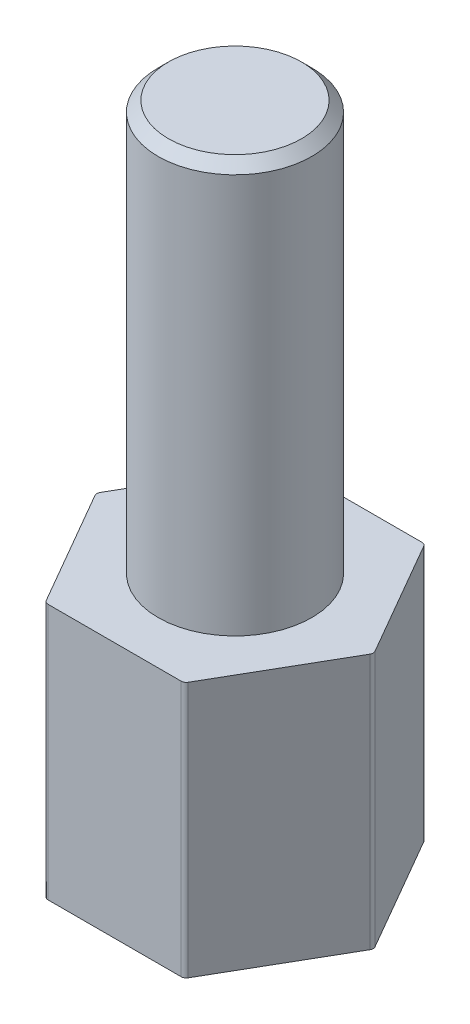
ISO-10303-21;
HEADER;
FILE_DESCRIPTION(('STEP AP214'),'2;1');
FILE_NAME('part.step','',(''),(''),'','','');
FILE_SCHEMA(('AUTOMOTIVE_DESIGN { 1 0 10303 214 1 1 1 1 }'));
ENDSEC;
DATA;
#1=APPLICATION_CONTEXT('core data for automotive mechanical design processes');
#2=APPLICATION_PROTOCOL_DEFINITION('international standard','automotive_design',2000,#1);
#3=PRODUCT_CONTEXT('',#1,'mechanical');
#4=PRODUCT('Part','Part','',(#3));
#5=PRODUCT_RELATED_PRODUCT_CATEGORY('part','',(#4));
#6=PRODUCT_DEFINITION_FORMATION('','',#4);
#7=PRODUCT_DEFINITION_CONTEXT('part definition',#1,'design');
#8=PRODUCT_DEFINITION('design','',#6,#7);
#9=PRODUCT_DEFINITION_SHAPE('','',#8);
#10=(LENGTH_UNIT() NAMED_UNIT(*) SI_UNIT(.MILLI.,.METRE.));
#11=(NAMED_UNIT(*) PLANE_ANGLE_UNIT() SI_UNIT($,.RADIAN.));
#12=(NAMED_UNIT(*) SI_UNIT($,.STERADIAN.) SOLID_ANGLE_UNIT());
#13=UNCERTAINTY_MEASURE_WITH_UNIT(LENGTH_MEASURE(1.E-05),#10,'distance_accuracy_value','');
#14=(GEOMETRIC_REPRESENTATION_CONTEXT(3) GLOBAL_UNCERTAINTY_ASSIGNED_CONTEXT((#13)) GLOBAL_UNIT_ASSIGNED_CONTEXT((#10,
#11,#12)) REPRESENTATION_CONTEXT('',''));
#15=CARTESIAN_POINT('',(0.,0.,0.));
#16=DIRECTION('',(0.,0.,1.));
#17=DIRECTION('',(1.,0.,0.));
#18=AXIS2_PLACEMENT_3D('',#15,#16,#17);
#19=CARTESIAN_POINT('',(1.35677313259565,5.,2.34999999999999));
#20=DIRECTION('',(-0.866025403784441,0.,-0.499999999999995));
#21=DIRECTION('',(-0.499999999999995,0.,0.866025403784441));
#22=AXIS2_PLACEMENT_3D('',#19,#20,#21);
#23=PLANE('',#22);
#24=DIRECTION('',(0.499999999999995,0.,-0.866025403784441));
#25=VECTOR('',#24,1.);
#26=CARTESIAN_POINT('',(1.35677313259565,5.,2.34999999999999));
#27=LINE('',#26,#25);
#28=CARTESIAN_POINT('',(1.38564064605513,5.,2.29999999999999));
#29=VERTEX_POINT('',#28);
#30=CARTESIAN_POINT('',(2.68467875173176,5.,0.0500000000000001));
#31=VERTEX_POINT('',#30);
#32=EDGE_CURVE('E148',#29,#31,#27,.T.);
#33=ORIENTED_EDGE('',*,*,#32,.F.);
#34=DIRECTION('',(0.,-1.,0.));
#35=VECTOR('',#34,1.);
#36=CARTESIAN_POINT('',(1.38564064605513,5.,2.29999999999999));
#37=LINE('',#36,#35);
#38=CARTESIAN_POINT('',(1.38564064605513,0.,2.29999999999999));
#39=VERTEX_POINT('',#38);
#40=EDGE_CURVE('E133',#29,#39,#37,.T.);
#41=ORIENTED_EDGE('',*,*,#40,.T.);
#42=DIRECTION('',(0.499999999999995,0.,-0.866025403784441));
#43=VECTOR('',#42,1.);
#44=CARTESIAN_POINT('',(1.35677313259565,0.,2.34999999999999));
#45=LINE('',#44,#43);
#46=CARTESIAN_POINT('',(2.68467875173176,0.,0.0500000000000001));
#47=VERTEX_POINT('',#46);
#48=EDGE_CURVE('E145',#39,#47,#45,.T.);
#49=ORIENTED_EDGE('',*,*,#48,.T.);
#50=DIRECTION('',(0.,-1.,0.));
#51=VECTOR('',#50,1.);
#52=CARTESIAN_POINT('',(2.68467875173176,5.,0.0499999999999997));
#53=LINE('',#52,#51);
#54=EDGE_CURVE('E150',#47,#31,#53,.F.);
#55=ORIENTED_EDGE('',*,*,#54,.T.);
#56=EDGE_LOOP('',(#33,#41,#49,#55));
#57=FACE_BOUND('',#56,.T.);
#58=ADVANCED_FACE('F39',(#57),#23,.F.);
#59=CARTESIAN_POINT('',(2.71354626519124,5.,0.));
#60=DIRECTION('',(-0.866025403784438,0.,0.500000000000001));
#61=DIRECTION('',(0.500000000000001,0.,0.866025403784438));
#62=AXIS2_PLACEMENT_3D('',#59,#60,#61);
#63=PLANE('',#62);
#64=DIRECTION('',(-0.500000000000001,0.,-0.866025403784438));
#65=VECTOR('',#64,1.);
#66=CARTESIAN_POINT('',(2.71354626519124,0.,0.));
#67=LINE('',#66,#65);
#68=CARTESIAN_POINT('',(2.68467875173176,0.,-0.0499999999999996));
#69=VERTEX_POINT('',#68);
#70=CARTESIAN_POINT('',(1.3856406460551,0.,-2.30000000000001));
#71=VERTEX_POINT('',#70);
#72=EDGE_CURVE('E154',#69,#71,#67,.T.);
#73=ORIENTED_EDGE('',*,*,#72,.T.);
#74=DIRECTION('',(0.,-1.,0.));
#75=VECTOR('',#74,1.);
#76=CARTESIAN_POINT('',(1.3856406460551,5.,-2.30000000000001));
#77=LINE('',#76,#75);
#78=CARTESIAN_POINT('',(1.3856406460551,5.,-2.30000000000001));
#79=VERTEX_POINT('',#78);
#80=EDGE_CURVE('E11',#71,#79,#77,.F.);
#81=ORIENTED_EDGE('',*,*,#80,.T.);
#82=DIRECTION('',(-0.500000000000001,0.,-0.866025403784438));
#83=VECTOR('',#82,1.);
#84=CARTESIAN_POINT('',(2.71354626519124,5.,0.));
#85=LINE('',#84,#83);
#86=CARTESIAN_POINT('',(2.68467875173176,5.,-0.0499999999999996));
#87=VERTEX_POINT('',#86);
#88=EDGE_CURVE('E231',#87,#79,#85,.T.);
#89=ORIENTED_EDGE('',*,*,#88,.F.);
#90=DIRECTION('',(0.,-1.,0.));
#91=VECTOR('',#90,1.);
#92=CARTESIAN_POINT('',(2.68467875173176,5.,-0.0499999999999996));
#93=LINE('',#92,#91);
#94=EDGE_CURVE('E47',#87,#69,#93,.T.);
#95=ORIENTED_EDGE('',*,*,#94,.T.);
#96=EDGE_LOOP('',(#73,#81,#89,#95));
#97=FACE_BOUND('',#96,.T.);
#98=ADVANCED_FACE('F228',(#97),#63,.F.);
#99=CARTESIAN_POINT('',(1.35677313259562,5.,-2.35000000000001));
#100=DIRECTION('',(0.,0.,1.));
#101=DIRECTION('',(1.,0.,0.));
#102=AXIS2_PLACEMENT_3D('',#99,#100,#101);
#103=PLANE('',#102);
#104=DIRECTION('',(-1.,0.,0.));
#105=VECTOR('',#104,1.);
#106=CARTESIAN_POINT('',(1.35677313259562,0.,-2.35000000000001));
#107=LINE('',#106,#105);
#108=CARTESIAN_POINT('',(1.29903810567665,0.,-2.35000000000001));
#109=VERTEX_POINT('',#108);
#110=CARTESIAN_POINT('',(-1.29903810567667,0.,-2.35));
#111=VERTEX_POINT('',#110);
#112=EDGE_CURVE('E158',#109,#111,#107,.T.);
#113=ORIENTED_EDGE('',*,*,#112,.T.);
#114=DIRECTION('',(0.,-1.,0.));
#115=VECTOR('',#114,1.);
#116=CARTESIAN_POINT('',(-1.29903810567667,5.,-2.35));
#117=LINE('',#116,#115);
#118=CARTESIAN_POINT('',(-1.29903810567667,5.,-2.35));
#119=VERTEX_POINT('',#118);
#120=EDGE_CURVE('E223',#111,#119,#117,.F.);
#121=ORIENTED_EDGE('',*,*,#120,.T.);
#122=DIRECTION('',(-1.,0.,0.));
#123=VECTOR('',#122,1.);
#124=CARTESIAN_POINT('',(1.35677313259562,5.,-2.35000000000001));
#125=LINE('',#124,#123);
#126=CARTESIAN_POINT('',(1.29903810567665,5.,-2.35000000000001));
#127=VERTEX_POINT('',#126);
#128=EDGE_CURVE('E244',#127,#119,#125,.T.);
#129=ORIENTED_EDGE('',*,*,#128,.F.);
#130=DIRECTION('',(0.,-1.,0.));
#131=VECTOR('',#130,1.);
#132=CARTESIAN_POINT('',(1.29903810567665,5.,-2.35000000000001));
#133=LINE('',#132,#131);
#134=EDGE_CURVE('E220',#127,#109,#133,.T.);
#135=ORIENTED_EDGE('',*,*,#134,.T.);
#136=EDGE_LOOP('',(#113,#121,#129,#135));
#137=FACE_BOUND('',#136,.T.);
#138=ADVANCED_FACE('F241',(#137),#103,.F.);
#139=CARTESIAN_POINT('',(-1.35677313259563,5.,-2.35));
#140=DIRECTION('',(0.866025403784442,0.,0.499999999999995));
#141=DIRECTION('',(0.499999999999995,0.,-0.866025403784442));
#142=AXIS2_PLACEMENT_3D('',#139,#140,#141);
#143=PLANE('',#142);
#144=DIRECTION('',(-0.499999999999995,0.,0.866025403784441));
#145=VECTOR('',#144,1.);
#146=CARTESIAN_POINT('',(-1.35677313259563,0.,-2.35));
#147=LINE('',#146,#145);
#148=CARTESIAN_POINT('',(-1.38564064605511,0.,-2.3));
#149=VERTEX_POINT('',#148);
#150=CARTESIAN_POINT('',(-2.68467875173176,0.,-0.0499999999999824));
#151=VERTEX_POINT('',#150);
#152=EDGE_CURVE('E169',#149,#151,#147,.T.);
#153=ORIENTED_EDGE('',*,*,#152,.T.);
#154=DIRECTION('',(0.,-1.,0.));
#155=VECTOR('',#154,1.);
#156=CARTESIAN_POINT('',(-2.68467875173176,5.,-0.0499999999999815));
#157=LINE('',#156,#155);
#158=CARTESIAN_POINT('',(-2.68467875173176,5.,-0.0499999999999824));
#159=VERTEX_POINT('',#158);
#160=EDGE_CURVE('E218',#151,#159,#157,.F.);
#161=ORIENTED_EDGE('',*,*,#160,.T.);
#162=DIRECTION('',(-0.499999999999995,0.,0.866025403784441));
#163=VECTOR('',#162,1.);
#164=CARTESIAN_POINT('',(-1.35677313259563,5.,-2.35));
#165=LINE('',#164,#163);
#166=CARTESIAN_POINT('',(-1.38564064605511,5.,-2.3));
#167=VERTEX_POINT('',#166);
#168=EDGE_CURVE('E246',#167,#159,#165,.T.);
#169=ORIENTED_EDGE('',*,*,#168,.F.);
#170=DIRECTION('',(0.,-1.,0.));
#171=VECTOR('',#170,1.);
#172=CARTESIAN_POINT('',(-1.38564064605511,5.,-2.3));
#173=LINE('',#172,#171);
#174=EDGE_CURVE('E215',#167,#149,#173,.T.);
#175=ORIENTED_EDGE('',*,*,#174,.T.);
#176=EDGE_LOOP('',(#153,#161,#169,#175));
#177=FACE_BOUND('',#176,.T.);
#178=ADVANCED_FACE('F269',(#177),#143,.F.);
#179=CARTESIAN_POINT('',(-2.71354626519124,5.,0.));
#180=DIRECTION('',(0.866025403784434,0.,-0.500000000000007));
#181=DIRECTION('',(-0.500000000000007,0.,-0.866025403784435));
#182=AXIS2_PLACEMENT_3D('',#179,#180,#181);
#183=PLANE('',#182);
#184=DIRECTION('',(0.500000000000007,0.,0.866025403784435));
#185=VECTOR('',#184,1.);
#186=CARTESIAN_POINT('',(-2.71354626519124,0.,0.));
#187=LINE('',#186,#185);
#188=CARTESIAN_POINT('',(-2.68467875173176,0.,0.0500000000000188));
#189=VERTEX_POINT('',#188);
#190=CARTESIAN_POINT('',(-1.38564064605508,0.,2.30000000000001));
#191=VERTEX_POINT('',#190);
#192=EDGE_CURVE('E172',#189,#191,#187,.T.);
#193=ORIENTED_EDGE('',*,*,#192,.T.);
#194=DIRECTION('',(0.,-1.,0.));
#195=VECTOR('',#194,1.);
#196=CARTESIAN_POINT('',(-1.38564064605508,5.,2.30000000000001));
#197=LINE('',#196,#195);
#198=CARTESIAN_POINT('',(-1.38564064605508,5.,2.30000000000001));
#199=VERTEX_POINT('',#198);
#200=EDGE_CURVE('E54',#191,#199,#197,.F.);
#201=ORIENTED_EDGE('',*,*,#200,.T.);
#202=DIRECTION('',(0.500000000000007,0.,0.866025403784435));
#203=VECTOR('',#202,1.);
#204=CARTESIAN_POINT('',(-2.71354626519124,5.,0.));
#205=LINE('',#204,#203);
#206=CARTESIAN_POINT('',(-2.68467875173176,5.,0.0500000000000188));
#207=VERTEX_POINT('',#206);
#208=EDGE_CURVE('E248',#207,#199,#205,.T.);
#209=ORIENTED_EDGE('',*,*,#208,.F.);
#210=DIRECTION('',(0.,-1.,0.));
#211=VECTOR('',#210,1.);
#212=CARTESIAN_POINT('',(-2.68467875173176,5.,0.0500000000000188));
#213=LINE('',#212,#211);
#214=EDGE_CURVE('E211',#207,#189,#213,.T.);
#215=ORIENTED_EDGE('',*,*,#214,.T.);
#216=EDGE_LOOP('',(#193,#201,#209,#215));
#217=FACE_BOUND('',#216,.T.);
#218=ADVANCED_FACE('F262',(#217),#183,.F.);
#219=CARTESIAN_POINT('',(-1.3567731325956,5.,2.35000000000001));
#220=DIRECTION('',(0.,0.,-1.));
#221=DIRECTION('',(-1.,0.,0.));
#222=AXIS2_PLACEMENT_3D('',#219,#220,#221);
#223=PLANE('',#222);
#224=DIRECTION('',(1.,0.,0.));
#225=VECTOR('',#224,1.);
#226=CARTESIAN_POINT('',(-1.3567731325956,0.,2.35000000000001));
#227=LINE('',#226,#225);
#228=CARTESIAN_POINT('',(-1.29903810567664,0.,2.35000000000001));
#229=VERTEX_POINT('',#228);
#230=CARTESIAN_POINT('',(1.29903810567669,0.,2.34999999999999));
#231=VERTEX_POINT('',#230);
#232=EDGE_CURVE('E174',#229,#231,#227,.T.);
#233=ORIENTED_EDGE('',*,*,#232,.T.);
#234=DIRECTION('',(0.,-1.,0.));
#235=VECTOR('',#234,1.);
#236=CARTESIAN_POINT('',(1.29903810567669,5.,2.34999999999999));
#237=LINE('',#236,#235);
#238=CARTESIAN_POINT('',(1.29903810567669,5.,2.34999999999999));
#239=VERTEX_POINT('',#238);
#240=EDGE_CURVE('E134',#231,#239,#237,.F.);
#241=ORIENTED_EDGE('',*,*,#240,.T.);
#242=DIRECTION('',(1.,0.,0.));
#243=VECTOR('',#242,1.);
#244=CARTESIAN_POINT('',(-1.3567731325956,5.,2.35000000000001));
#245=LINE('',#244,#243);
#246=CARTESIAN_POINT('',(-1.29903810567664,5.,2.35000000000001));
#247=VERTEX_POINT('',#246);
#248=EDGE_CURVE('E164',#247,#239,#245,.T.);
#249=ORIENTED_EDGE('',*,*,#248,.F.);
#250=DIRECTION('',(0.,-1.,0.));
#251=VECTOR('',#250,1.);
#252=CARTESIAN_POINT('',(-1.29903810567664,5.,2.35000000000001));
#253=LINE('',#252,#251);
#254=EDGE_CURVE('E139',#247,#229,#253,.T.);
#255=ORIENTED_EDGE('',*,*,#254,.T.);
#256=EDGE_LOOP('',(#233,#241,#249,#255));
#257=FACE_BOUND('',#256,.T.);
#258=ADVANCED_FACE('F258',(#257),#223,.F.);
#259=CARTESIAN_POINT('',(0.,5.,0.));
#260=DIRECTION('',(0.,1.,0.));
#261=DIRECTION('',(0.,0.,1.));
#262=AXIS2_PLACEMENT_3D('',#259,#260,#261);
#263=PLANE('',#262);
#264=CARTESIAN_POINT('',(0.,5.,0.));
#265=DIRECTION('',(0.,1.,0.));
#266=DIRECTION('',(0.,0.,1.));
#267=AXIS2_PLACEMENT_3D('',#264,#265,#266);
#268=CIRCLE('',#267,1.5);
#269=CARTESIAN_POINT('',(0.,5.,1.5));
#270=VERTEX_POINT('',#269);
#271=EDGE_CURVE('E155',#270,#270,#268,.T.);
#272=ORIENTED_EDGE('',*,*,#271,.F.);
#273=EDGE_LOOP('',(#272));
#274=FACE_BOUND('',#273,.T.);
#275=ORIENTED_EDGE('',*,*,#248,.T.);
#276=CARTESIAN_POINT('',(1.29903810567669,5.,2.24999999999999));
#277=DIRECTION('',(0.,1.,0.));
#278=DIRECTION('',(0.,0.,1.));
#279=AXIS2_PLACEMENT_3D('',#276,#277,#278);
#280=CIRCLE('',#279,0.1);
#281=EDGE_CURVE('E209',#239,#29,#280,.T.);
#282=ORIENTED_EDGE('',*,*,#281,.T.);
#283=ORIENTED_EDGE('',*,*,#32,.T.);
#284=CARTESIAN_POINT('',(2.59807621135332,5.,0.));
#285=DIRECTION('',(0.,1.,0.));
#286=DIRECTION('',(0.,0.,1.));
#287=AXIS2_PLACEMENT_3D('',#284,#285,#286);
#288=CIRCLE('',#287,0.1);
#289=EDGE_CURVE('E200',#31,#87,#288,.T.);
#290=ORIENTED_EDGE('',*,*,#289,.T.);
#291=ORIENTED_EDGE('',*,*,#88,.T.);
#292=CARTESIAN_POINT('',(1.29903810567665,5.,-2.25000000000001));
#293=DIRECTION('',(0.,1.,0.));
#294=DIRECTION('',(0.,0.,1.));
#295=AXIS2_PLACEMENT_3D('',#292,#293,#294);
#296=CIRCLE('',#295,0.1);
#297=EDGE_CURVE('E202',#79,#127,#296,.T.);
#298=ORIENTED_EDGE('',*,*,#297,.T.);
#299=ORIENTED_EDGE('',*,*,#128,.T.);
#300=CARTESIAN_POINT('',(-1.29903810567667,5.,-2.25));
#301=DIRECTION('',(0.,1.,0.));
#302=DIRECTION('',(0.,0.,1.));
#303=AXIS2_PLACEMENT_3D('',#300,#301,#302);
#304=CIRCLE('',#303,0.1);
#305=EDGE_CURVE('E204',#119,#167,#304,.T.);
#306=ORIENTED_EDGE('',*,*,#305,.T.);
#307=ORIENTED_EDGE('',*,*,#168,.T.);
#308=CARTESIAN_POINT('',(-2.59807621135332,5.,0.));
#309=DIRECTION('',(0.,1.,0.));
#310=DIRECTION('',(0.,0.,1.));
#311=AXIS2_PLACEMENT_3D('',#308,#309,#310);
#312=CIRCLE('',#311,0.1);
#313=EDGE_CURVE('E61',#159,#207,#312,.T.);
#314=ORIENTED_EDGE('',*,*,#313,.T.);
#315=ORIENTED_EDGE('',*,*,#208,.T.);
#316=CARTESIAN_POINT('',(-1.29903810567664,5.,2.25000000000001));
#317=DIRECTION('',(0.,1.,0.));
#318=DIRECTION('',(0.,0.,1.));
#319=AXIS2_PLACEMENT_3D('',#316,#317,#318);
#320=CIRCLE('',#319,0.1);
#321=EDGE_CURVE('E207',#199,#247,#320,.T.);
#322=ORIENTED_EDGE('',*,*,#321,.T.);
#323=EDGE_LOOP('',(#275,#282,#283,#290,#291,#298,#299,#306,#307,#314,#315,#322));
#324=FACE_BOUND('',#323,.T.);
#325=ADVANCED_FACE('F255',(#274,#324),#263,.T.);
#326=CARTESIAN_POINT('',(0.,0.,0.));
#327=DIRECTION('',(0.,1.,0.));
#328=DIRECTION('',(0.,0.,1.));
#329=AXIS2_PLACEMENT_3D('',#326,#327,#328);
#330=PLANE('',#329);
#331=CARTESIAN_POINT('',(0.,0.,0.));
#332=DIRECTION('',(0.,-1.,0.));
#333=DIRECTION('',(0.,0.,-1.));
#334=AXIS2_PLACEMENT_3D('',#331,#332,#333);
#335=CIRCLE('',#334,1.5);
#336=CARTESIAN_POINT('',(0.,0.,-1.5));
#337=VERTEX_POINT('',#336);
#338=EDGE_CURVE('E161',#337,#337,#335,.T.);
#339=ORIENTED_EDGE('',*,*,#338,.F.);
#340=EDGE_LOOP('',(#339));
#341=FACE_BOUND('',#340,.T.);
#342=ORIENTED_EDGE('',*,*,#48,.F.);
#343=CARTESIAN_POINT('',(1.29903810567669,0.,2.24999999999999));
#344=DIRECTION('',(0.,1.,0.));
#345=DIRECTION('',(0.,0.,1.));
#346=AXIS2_PLACEMENT_3D('',#343,#344,#345);
#347=CIRCLE('',#346,0.1);
#348=EDGE_CURVE('E129',#39,#231,#347,.F.);
#349=ORIENTED_EDGE('',*,*,#348,.T.);
#350=ORIENTED_EDGE('',*,*,#232,.F.);
#351=CARTESIAN_POINT('',(-1.29903810567664,0.,2.25000000000001));
#352=DIRECTION('',(0.,1.,0.));
#353=DIRECTION('',(0.,0.,1.));
#354=AXIS2_PLACEMENT_3D('',#351,#352,#353);
#355=CIRCLE('',#354,0.1);
#356=EDGE_CURVE('E140',#229,#191,#355,.F.);
#357=ORIENTED_EDGE('',*,*,#356,.T.);
#358=ORIENTED_EDGE('',*,*,#192,.F.);
#359=CARTESIAN_POINT('',(-2.59807621135332,0.,0.));
#360=DIRECTION('',(0.,1.,0.));
#361=DIRECTION('',(0.,0.,1.));
#362=AXIS2_PLACEMENT_3D('',#359,#360,#361);
#363=CIRCLE('',#362,0.1);
#364=EDGE_CURVE('E194',#189,#151,#363,.F.);
#365=ORIENTED_EDGE('',*,*,#364,.T.);
#366=ORIENTED_EDGE('',*,*,#152,.F.);
#367=CARTESIAN_POINT('',(-1.29903810567667,0.,-2.25));
#368=DIRECTION('',(0.,1.,0.));
#369=DIRECTION('',(0.,0.,1.));
#370=AXIS2_PLACEMENT_3D('',#367,#368,#369);
#371=CIRCLE('',#370,0.1);
#372=EDGE_CURVE('E192',#149,#111,#371,.F.);
#373=ORIENTED_EDGE('',*,*,#372,.T.);
#374=ORIENTED_EDGE('',*,*,#112,.F.);
#375=CARTESIAN_POINT('',(1.29903810567665,0.,-2.25000000000001));
#376=DIRECTION('',(0.,1.,0.));
#377=DIRECTION('',(0.,0.,1.));
#378=AXIS2_PLACEMENT_3D('',#375,#376,#377);
#379=CIRCLE('',#378,0.1);
#380=EDGE_CURVE('E190',#109,#71,#379,.F.);
#381=ORIENTED_EDGE('',*,*,#380,.T.);
#382=ORIENTED_EDGE('',*,*,#72,.F.);
#383=CARTESIAN_POINT('',(2.59807621135332,0.,0.));
#384=DIRECTION('',(0.,1.,0.));
#385=DIRECTION('',(0.,0.,1.));
#386=AXIS2_PLACEMENT_3D('',#383,#384,#385);
#387=CIRCLE('',#386,0.1);
#388=EDGE_CURVE('E149',#69,#47,#387,.F.);
#389=ORIENTED_EDGE('',*,*,#388,.T.);
#390=EDGE_LOOP('',(#342,#349,#350,#357,#358,#365,#366,#373,#374,#381,#382,#389));
#391=FACE_BOUND('',#390,.T.);
#392=ADVANCED_FACE('F152',(#341,#391),#330,.F.);
#393=CARTESIAN_POINT('',(0.,13.,0.));
#394=DIRECTION('',(0.,-1.,0.));
#395=DIRECTION('',(0.,0.,-1.));
#396=AXIS2_PLACEMENT_3D('',#393,#394,#395);
#397=CYLINDRICAL_SURFACE('',#396,1.5);
#398=CARTESIAN_POINT('',(0.,12.8,0.));
#399=DIRECTION('',(0.,1.,0.));
#400=DIRECTION('',(0.,0.,1.));
#401=AXIS2_PLACEMENT_3D('',#398,#399,#400);
#402=CIRCLE('',#401,1.5);
#403=CARTESIAN_POINT('',(0.,12.8,1.5));
#404=VERTEX_POINT('',#403);
#405=EDGE_CURVE('E185',#404,#404,#402,.F.);
#406=ORIENTED_EDGE('',*,*,#405,.T.);
#407=EDGE_LOOP('',(#406));
#408=FACE_BOUND('',#407,.T.);
#409=ORIENTED_EDGE('',*,*,#271,.T.);
#410=EDGE_LOOP('',(#409));
#411=FACE_BOUND('',#410,.T.);
#412=ADVANCED_FACE('F337',(#408,#411),#397,.T.);
#413=CARTESIAN_POINT('',(0.,13.,0.));
#414=DIRECTION('',(0.,1.,0.));
#415=DIRECTION('',(0.,0.,1.));
#416=AXIS2_PLACEMENT_3D('',#413,#414,#415);
#417=PLANE('',#416);
#418=CARTESIAN_POINT('',(0.,13.,0.));
#419=DIRECTION('',(0.,1.,0.));
#420=DIRECTION('',(0.,0.,1.));
#421=AXIS2_PLACEMENT_3D('',#418,#419,#420);
#422=CIRCLE('',#421,1.3);
#423=CARTESIAN_POINT('',(0.,13.,1.3));
#424=VERTEX_POINT('',#423);
#425=EDGE_CURVE('E182',#424,#424,#422,.T.);
#426=ORIENTED_EDGE('',*,*,#425,.T.);
#427=EDGE_LOOP('',(#426));
#428=FACE_BOUND('',#427,.T.);
#429=ADVANCED_FACE('F343',(#428),#417,.T.);
#430=CARTESIAN_POINT('',(0.,4.,0.));
#431=DIRECTION('',(0.,-1.,0.));
#432=DIRECTION('',(0.,0.,-1.));
#433=AXIS2_PLACEMENT_3D('',#430,#431,#432);
#434=CYLINDRICAL_SURFACE('',#433,1.5);
#435=CARTESIAN_POINT('',(0.,3.8,0.));
#436=DIRECTION('',(0.,-1.,0.));
#437=DIRECTION('',(0.,0.,-1.));
#438=AXIS2_PLACEMENT_3D('',#435,#436,#437);
#439=CIRCLE('',#438,1.5);
#440=CARTESIAN_POINT('',(0.,3.8,-1.5));
#441=VERTEX_POINT('',#440);
#442=EDGE_CURVE('E179',#441,#441,#439,.F.);
#443=ORIENTED_EDGE('',*,*,#442,.T.);
#444=EDGE_LOOP('',(#443));
#445=FACE_BOUND('',#444,.T.);
#446=ORIENTED_EDGE('',*,*,#338,.T.);
#447=EDGE_LOOP('',(#446));
#448=FACE_BOUND('',#447,.T.);
#449=ADVANCED_FACE('F334',(#445,#448),#434,.F.);
#450=CARTESIAN_POINT('',(0.,4.,0.));
#451=DIRECTION('',(0.,-1.,0.));
#452=DIRECTION('',(0.,0.,-1.));
#453=AXIS2_PLACEMENT_3D('',#450,#451,#452);
#454=PLANE('',#453);
#455=CARTESIAN_POINT('',(0.,4.,0.));
#456=DIRECTION('',(0.,-1.,0.));
#457=DIRECTION('',(0.,0.,-1.));
#458=AXIS2_PLACEMENT_3D('',#455,#456,#457);
#459=CIRCLE('',#458,1.3);
#460=CARTESIAN_POINT('',(0.,4.,-1.3));
#461=VERTEX_POINT('',#460);
#462=EDGE_CURVE('E176',#461,#461,#459,.T.);
#463=ORIENTED_EDGE('',*,*,#462,.T.);
#464=EDGE_LOOP('',(#463));
#465=FACE_BOUND('',#464,.T.);
#466=ADVANCED_FACE('F293',(#465),#454,.T.);
#467=CARTESIAN_POINT('',(0.,4.,0.));
#468=DIRECTION('',(0.,-1.,0.));
#469=DIRECTION('',(0.,0.,-1.));
#470=AXIS2_PLACEMENT_3D('',#467,#468,#469);
#471=CONICAL_SURFACE('',#470,1.3,0.785398163397455);
#472=CARTESIAN_POINT('',(0.,3.8,-1.5));
#473=CARTESIAN_POINT('',(0.,3.80208333333333,-1.49791666666667));
#474=CARTESIAN_POINT('',(0.,3.80416666666667,-1.49583333333333));
#475=CARTESIAN_POINT('',(0.,3.80833333333333,-1.49166666666667));
#476=CARTESIAN_POINT('',(0.,3.81041666666667,-1.48958333333333));
#477=CARTESIAN_POINT('',(0.,3.81458333333333,-1.48541666666667));
#478=CARTESIAN_POINT('',(0.,3.81666666666667,-1.48333333333333));
#479=CARTESIAN_POINT('',(0.,3.82083333333333,-1.47916666666667));
#480=CARTESIAN_POINT('',(0.,3.82291666666667,-1.47708333333333));
#481=CARTESIAN_POINT('',(0.,3.82708333333333,-1.47291666666667));
#482=CARTESIAN_POINT('',(0.,3.82916666666667,-1.47083333333333));
#483=CARTESIAN_POINT('',(0.,3.83333333333333,-1.46666666666667));
#484=CARTESIAN_POINT('',(0.,3.83541666666667,-1.46458333333333));
#485=CARTESIAN_POINT('',(0.,3.83958333333333,-1.46041666666667));
#486=CARTESIAN_POINT('',(0.,3.84166666666667,-1.45833333333333));
#487=CARTESIAN_POINT('',(0.,3.84583333333333,-1.45416666666667));
#488=CARTESIAN_POINT('',(0.,3.84791666666667,-1.45208333333333));
#489=CARTESIAN_POINT('',(0.,3.85208333333333,-1.44791666666667));
#490=CARTESIAN_POINT('',(0.,3.85416666666667,-1.44583333333333));
#491=CARTESIAN_POINT('',(0.,3.85833333333333,-1.44166666666667));
#492=CARTESIAN_POINT('',(0.,3.86041666666667,-1.43958333333333));
#493=CARTESIAN_POINT('',(0.,3.86458333333333,-1.43541666666667));
#494=CARTESIAN_POINT('',(0.,3.86666666666667,-1.43333333333333));
#495=CARTESIAN_POINT('',(0.,3.87083333333333,-1.42916666666667));
#496=CARTESIAN_POINT('',(0.,3.87291666666667,-1.42708333333333));
#497=CARTESIAN_POINT('',(0.,3.87708333333333,-1.42291666666667));
#498=CARTESIAN_POINT('',(0.,3.87916666666667,-1.42083333333333));
#499=CARTESIAN_POINT('',(0.,3.88333333333333,-1.41666666666667));
#500=CARTESIAN_POINT('',(0.,3.88541666666667,-1.41458333333333));
#501=CARTESIAN_POINT('',(0.,3.88958333333333,-1.41041666666667));
#502=CARTESIAN_POINT('',(0.,3.89166666666667,-1.40833333333333));
#503=CARTESIAN_POINT('',(0.,3.89583333333333,-1.40416666666666));
#504=CARTESIAN_POINT('',(0.,3.89791666666667,-1.40208333333333));
#505=CARTESIAN_POINT('',(0.,3.90208333333333,-1.39791666666666));
#506=CARTESIAN_POINT('',(0.,3.90416666666667,-1.39583333333333));
#507=CARTESIAN_POINT('',(0.,3.90833333333333,-1.39166666666667));
#508=CARTESIAN_POINT('',(0.,3.91041666666667,-1.38958333333333));
#509=CARTESIAN_POINT('',(0.,3.91458333333333,-1.38541666666666));
#510=CARTESIAN_POINT('',(0.,3.91666666666667,-1.38333333333333));
#511=CARTESIAN_POINT('',(0.,3.92083333333333,-1.37916666666666));
#512=CARTESIAN_POINT('',(0.,3.92291666666667,-1.37708333333333));
#513=CARTESIAN_POINT('',(0.,3.92708333333333,-1.37291666666666));
#514=CARTESIAN_POINT('',(0.,3.92916666666667,-1.37083333333333));
#515=CARTESIAN_POINT('',(0.,3.93333333333333,-1.36666666666666));
#516=CARTESIAN_POINT('',(0.,3.93541666666667,-1.36458333333333));
#517=CARTESIAN_POINT('',(0.,3.93958333333333,-1.36041666666666));
#518=CARTESIAN_POINT('',(0.,3.94166666666667,-1.35833333333333));
#519=CARTESIAN_POINT('',(0.,3.94583333333333,-1.35416666666666));
#520=CARTESIAN_POINT('',(0.,3.94791666666667,-1.35208333333333));
#521=CARTESIAN_POINT('',(0.,3.95208333333333,-1.34791666666666));
#522=CARTESIAN_POINT('',(0.,3.95416666666667,-1.34583333333333));
#523=CARTESIAN_POINT('',(0.,3.95833333333333,-1.34166666666666));
#524=CARTESIAN_POINT('',(0.,3.96041666666667,-1.33958333333333));
#525=CARTESIAN_POINT('',(0.,3.96458333333333,-1.33541666666666));
#526=CARTESIAN_POINT('',(0.,3.96666666666667,-1.33333333333333));
#527=CARTESIAN_POINT('',(0.,3.97083333333333,-1.32916666666666));
#528=CARTESIAN_POINT('',(0.,3.97291666666667,-1.32708333333333));
#529=CARTESIAN_POINT('',(0.,3.97708333333333,-1.32291666666666));
#530=CARTESIAN_POINT('',(0.,3.97916666666667,-1.32083333333333));
#531=CARTESIAN_POINT('',(0.,3.98333333333333,-1.31666666666666));
#532=CARTESIAN_POINT('',(0.,3.98541666666667,-1.31458333333333));
#533=CARTESIAN_POINT('',(0.,3.98958333333333,-1.31041666666666));
#534=CARTESIAN_POINT('',(0.,3.99166666666667,-1.30833333333333));
#535=CARTESIAN_POINT('',(0.,3.99583333333333,-1.30416666666666));
#536=CARTESIAN_POINT('',(0.,3.99791666666667,-1.30208333333333));
#537=CARTESIAN_POINT('',(0.,4.,-1.3));
#538=B_SPLINE_CURVE_WITH_KNOTS('',3,(#472,#473,#474,#475,#476,#477,#478,#479,#480,#481,#482,
#483,#484,#485,#486,#487,#488,#489,#490,#491,#492,#493,#494,#495,#496,#497,#498,#499,#500,#501,
#502,#503,#504,#505,#506,#507,#508,#509,#510,#511,#512,#513,#514,#515,#516,#517,#518,#519,#520,
#521,#522,#523,#524,#525,#526,#527,#528,#529,#530,#531,#532,#533,#534,#535,#536,#537),
.UNSPECIFIED.,.F.,.F.,(4,2,2,2,2,2,2,2,2,2,2,2,2,2,2,2,2,2,2,2,2,2,2,2,2,2,2,2,2,2,2,2,4),(0.,
0.00883883476483164,0.0176776695296637,0.0265165042944955,0.0353553390593275,0.0441941738241593,
0.0530330085889912,0.0618718433538233,0.0707106781186549,0.079549512883487,0.0883883476483188,
0.0972271824131508,0.106066017177983,0.114904851942815,0.123743686707647,0.132582521472478,
0.14142135623731,0.150260191002142,0.159099025766974,0.167937860531806,0.176776695296638,
0.18561553006147,0.194454364826302,0.203293199591133,0.212132034355965,0.220970869120797,
0.229809703885629,0.238648538650461,0.247487373415293,0.256326208180125,0.265165042944957,
0.274003877709789,0.28284271247462),.UNSPECIFIED.);
#539=EDGE_CURVE('BSEAM289',#441,#461,#538,.T.);
#540=ORIENTED_EDGE('',*,*,#442,.F.);
#541=ORIENTED_EDGE('',*,*,#462,.F.);
#542=ORIENTED_EDGE('',*,*,#539,.T.);
#543=ORIENTED_EDGE('',*,*,#539,.F.);
#544=EDGE_LOOP('',(#540,#542,#541,#543));
#545=FACE_BOUND('',#544,.T.);
#546=ADVANCED_FACE('F289',(#545),#471,.F.);
#547=CARTESIAN_POINT('',(0.,13.,0.));
#548=DIRECTION('',(0.,-1.,0.));
#549=DIRECTION('',(0.,0.,-1.));
#550=AXIS2_PLACEMENT_3D('',#547,#548,#549);
#551=CONICAL_SURFACE('',#550,1.3,0.785398163397449);
#552=ORIENTED_EDGE('',*,*,#405,.F.);
#553=EDGE_LOOP('',(#552));
#554=FACE_BOUND('',#553,.T.);
#555=ORIENTED_EDGE('',*,*,#425,.F.);
#556=EDGE_LOOP('',(#555));
#557=FACE_BOUND('',#556,.T.);
#558=ADVANCED_FACE('F292',(#554,#557),#551,.T.);
#559=CARTESIAN_POINT('',(1.29903810567669,5.,2.24999999999999));
#560=DIRECTION('',(0.,-1.,0.));
#561=DIRECTION('',(0.,0.,-1.));
#562=AXIS2_PLACEMENT_3D('',#559,#560,#561);
#563=CYLINDRICAL_SURFACE('',#562,0.1);
#564=ORIENTED_EDGE('',*,*,#281,.F.);
#565=ORIENTED_EDGE('',*,*,#240,.F.);
#566=ORIENTED_EDGE('',*,*,#348,.F.);
#567=ORIENTED_EDGE('',*,*,#40,.F.);
#568=EDGE_LOOP('',(#564,#565,#566,#567));
#569=FACE_BOUND('',#568,.T.);
#570=ADVANCED_FACE('F132',(#569),#563,.T.);
#571=CARTESIAN_POINT('',(-1.29903810567664,5.,2.25000000000001));
#572=DIRECTION('',(0.,-1.,0.));
#573=DIRECTION('',(0.,0.,-1.));
#574=AXIS2_PLACEMENT_3D('',#571,#572,#573);
#575=CYLINDRICAL_SURFACE('',#574,0.1);
#576=ORIENTED_EDGE('',*,*,#321,.F.);
#577=ORIENTED_EDGE('',*,*,#200,.F.);
#578=ORIENTED_EDGE('',*,*,#356,.F.);
#579=ORIENTED_EDGE('',*,*,#254,.F.);
#580=EDGE_LOOP('',(#576,#577,#578,#579));
#581=FACE_BOUND('',#580,.T.);
#582=ADVANCED_FACE('F260',(#581),#575,.T.);
#583=CARTESIAN_POINT('',(-2.59807621135332,5.,0.));
#584=DIRECTION('',(0.,-1.,0.));
#585=DIRECTION('',(0.,0.,-1.));
#586=AXIS2_PLACEMENT_3D('',#583,#584,#585);
#587=CYLINDRICAL_SURFACE('',#586,0.1);
#588=ORIENTED_EDGE('',*,*,#313,.F.);
#589=ORIENTED_EDGE('',*,*,#160,.F.);
#590=ORIENTED_EDGE('',*,*,#364,.F.);
#591=ORIENTED_EDGE('',*,*,#214,.F.);
#592=EDGE_LOOP('',(#588,#589,#590,#591));
#593=FACE_BOUND('',#592,.T.);
#594=ADVANCED_FACE('F265',(#593),#587,.T.);
#595=CARTESIAN_POINT('',(-1.29903810567667,5.,-2.25));
#596=DIRECTION('',(0.,-1.,0.));
#597=DIRECTION('',(0.,0.,-1.));
#598=AXIS2_PLACEMENT_3D('',#595,#596,#597);
#599=CYLINDRICAL_SURFACE('',#598,0.1);
#600=ORIENTED_EDGE('',*,*,#305,.F.);
#601=ORIENTED_EDGE('',*,*,#120,.F.);
#602=ORIENTED_EDGE('',*,*,#372,.F.);
#603=ORIENTED_EDGE('',*,*,#174,.F.);
#604=EDGE_LOOP('',(#600,#601,#602,#603));
#605=FACE_BOUND('',#604,.T.);
#606=ADVANCED_FACE('F273',(#605),#599,.T.);
#607=CARTESIAN_POINT('',(1.29903810567665,5.,-2.25000000000001));
#608=DIRECTION('',(0.,-1.,0.));
#609=DIRECTION('',(0.,0.,-1.));
#610=AXIS2_PLACEMENT_3D('',#607,#608,#609);
#611=CYLINDRICAL_SURFACE('',#610,0.1);
#612=ORIENTED_EDGE('',*,*,#297,.F.);
#613=ORIENTED_EDGE('',*,*,#80,.F.);
#614=ORIENTED_EDGE('',*,*,#380,.F.);
#615=ORIENTED_EDGE('',*,*,#134,.F.);
#616=EDGE_LOOP('',(#612,#613,#614,#615));
#617=FACE_BOUND('',#616,.T.);
#618=ADVANCED_FACE('F238',(#617),#611,.T.);
#619=CARTESIAN_POINT('',(2.59807621135332,5.,0.));
#620=DIRECTION('',(0.,-1.,0.));
#621=DIRECTION('',(0.,0.,-1.));
#622=AXIS2_PLACEMENT_3D('',#619,#620,#621);
#623=CYLINDRICAL_SURFACE('',#622,0.1);
#624=ORIENTED_EDGE('',*,*,#289,.F.);
#625=ORIENTED_EDGE('',*,*,#54,.F.);
#626=ORIENTED_EDGE('',*,*,#388,.F.);
#627=ORIENTED_EDGE('',*,*,#94,.F.);
#628=EDGE_LOOP('',(#624,#625,#626,#627));
#629=FACE_BOUND('',#628,.T.);
#630=ADVANCED_FACE('F41',(#629),#623,.T.);
#631=CLOSED_SHELL('',(#58,#98,#138,#178,#218,#258,#325,#392,#412,#429,#449,#466,#546,#558,#570,
#582,#594,#606,#618,#630));
#632=MANIFOLD_SOLID_BREP('B2',#631);
#633=ADVANCED_BREP_SHAPE_REPRESENTATION('',(#18,#632),#14);
#634=SHAPE_DEFINITION_REPRESENTATION(#9,#633);
ENDSEC;
END-ISO-10303-21;
